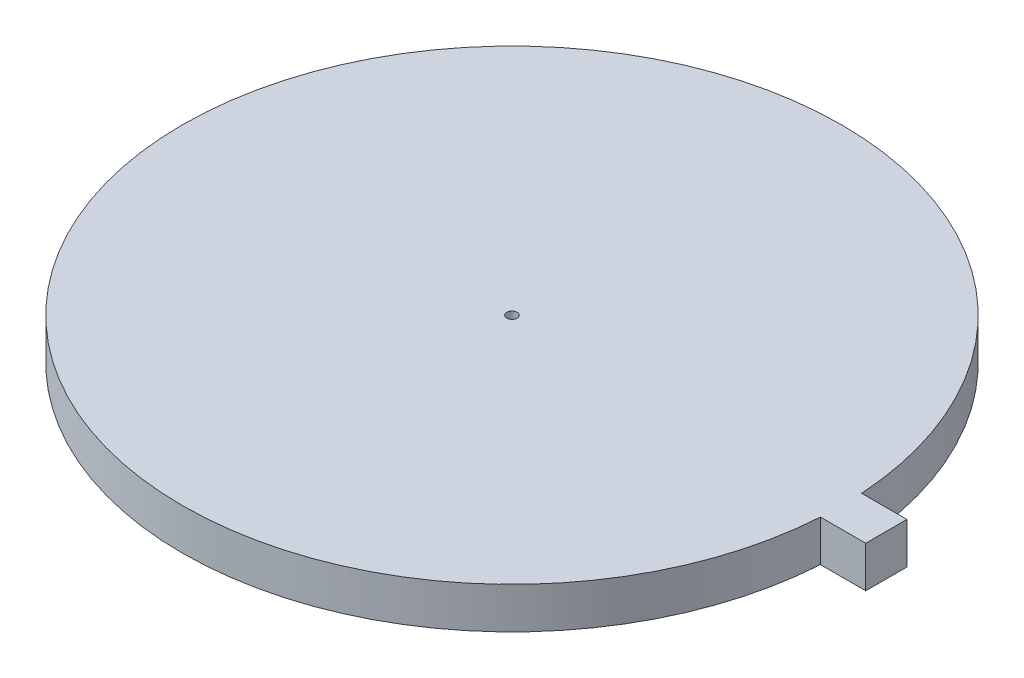
ISO-10303-21;
HEADER;
FILE_DESCRIPTION(('STEP AP214'),'2;1');
FILE_NAME('part.step','',(''),(''),'','','');
FILE_SCHEMA(('AUTOMOTIVE_DESIGN { 1 0 10303 214 1 1 1 1 }'));
ENDSEC;
DATA;
#1=APPLICATION_CONTEXT('core data for automotive mechanical design processes');
#2=APPLICATION_PROTOCOL_DEFINITION('international standard','automotive_design',2000,#1);
#3=PRODUCT_CONTEXT('',#1,'mechanical');
#4=PRODUCT('Part','Part','',(#3));
#5=PRODUCT_RELATED_PRODUCT_CATEGORY('part','',(#4));
#6=PRODUCT_DEFINITION_FORMATION('','',#4);
#7=PRODUCT_DEFINITION_CONTEXT('part definition',#1,'design');
#8=PRODUCT_DEFINITION('design','',#6,#7);
#9=PRODUCT_DEFINITION_SHAPE('','',#8);
#10=(LENGTH_UNIT() NAMED_UNIT(*) SI_UNIT(.MILLI.,.METRE.));
#11=(NAMED_UNIT(*) PLANE_ANGLE_UNIT() SI_UNIT($,.RADIAN.));
#12=(NAMED_UNIT(*) SI_UNIT($,.STERADIAN.) SOLID_ANGLE_UNIT());
#13=UNCERTAINTY_MEASURE_WITH_UNIT(LENGTH_MEASURE(1.E-05),#10,'distance_accuracy_value','');
#14=(GEOMETRIC_REPRESENTATION_CONTEXT(3) GLOBAL_UNCERTAINTY_ASSIGNED_CONTEXT((#13)) GLOBAL_UNIT_ASSIGNED_CONTEXT((#10,
#11,#12)) REPRESENTATION_CONTEXT('',''));
#15=CARTESIAN_POINT('',(0.,0.,0.));
#16=DIRECTION('',(0.,0.,1.));
#17=DIRECTION('',(1.,0.,0.));
#18=AXIS2_PLACEMENT_3D('',#15,#16,#17);
#19=CARTESIAN_POINT('',(0.,12.7,0.));
#20=DIRECTION('',(0.,1.,0.));
#21=DIRECTION('',(0.,0.,1.));
#22=AXIS2_PLACEMENT_3D('',#19,#20,#21);
#23=PLANE('',#22);
#24=DIRECTION('',(-1.,0.,0.));
#25=VECTOR('',#24,1.);
#26=CARTESIAN_POINT('',(115.371368333963,12.7,-6.35));
#27=LINE('',#26,#25);
#28=CARTESIAN_POINT('',(115.371368333963,12.7,-6.35));
#29=VERTEX_POINT('',#28);
#30=CARTESIAN_POINT('',(101.401368333963,12.7,-6.35));
#31=VERTEX_POINT('',#30);
#32=EDGE_CURVE('E114',#29,#31,#27,.T.);
#33=ORIENTED_EDGE('',*,*,#32,.T.);
#34=CARTESIAN_POINT('',(0.,12.7,0.));
#35=DIRECTION('',(0.,1.,0.));
#36=DIRECTION('',(0.,0.,1.));
#37=AXIS2_PLACEMENT_3D('',#34,#35,#36);
#38=CIRCLE('',#37,101.6);
#39=CARTESIAN_POINT('',(101.401368333963,12.7,6.34999999999997));
#40=VERTEX_POINT('',#39);
#41=EDGE_CURVE('E109',#31,#40,#38,.T.);
#42=ORIENTED_EDGE('',*,*,#41,.T.);
#43=DIRECTION('',(-1.,0.,0.));
#44=VECTOR('',#43,1.);
#45=CARTESIAN_POINT('',(115.371368333963,12.7,6.35));
#46=LINE('',#45,#44);
#47=CARTESIAN_POINT('',(115.371368333963,12.7,6.35));
#48=VERTEX_POINT('',#47);
#49=EDGE_CURVE('E112',#48,#40,#46,.T.);
#50=ORIENTED_EDGE('',*,*,#49,.F.);
#51=DIRECTION('',(0.,0.,1.));
#52=VECTOR('',#51,1.);
#53=CARTESIAN_POINT('',(115.371368333963,12.7,3.17500000000013));
#54=LINE('',#53,#52);
#55=EDGE_CURVE('E81',#29,#48,#54,.T.);
#56=ORIENTED_EDGE('',*,*,#55,.F.);
#57=EDGE_LOOP('',(#33,#42,#50,#56));
#58=FACE_BOUND('',#57,.T.);
#59=CARTESIAN_POINT('',(0.,12.7,0.));
#60=DIRECTION('',(0.,1.,0.));
#61=DIRECTION('',(0.,0.,1.));
#62=AXIS2_PLACEMENT_3D('',#59,#60,#61);
#63=CIRCLE('',#62,1.5875);
#64=CARTESIAN_POINT('',(0.,12.7,1.5875));
#65=VERTEX_POINT('',#64);
#66=EDGE_CURVE('E137',#65,#65,#63,.T.);
#67=ORIENTED_EDGE('',*,*,#66,.F.);
#68=EDGE_LOOP('',(#67));
#69=FACE_BOUND('',#68,.T.);
#70=ADVANCED_FACE('F63',(#58,#69),#23,.T.);
#71=CARTESIAN_POINT('',(0.,0.,0.));
#72=DIRECTION('',(0.,1.,0.));
#73=DIRECTION('',(0.,0.,1.));
#74=AXIS2_PLACEMENT_3D('',#71,#72,#73);
#75=PLANE('',#74);
#76=DIRECTION('',(-1.,0.,0.));
#77=VECTOR('',#76,1.);
#78=CARTESIAN_POINT('',(115.371368333963,0.,-6.35));
#79=LINE('',#78,#77);
#80=CARTESIAN_POINT('',(115.371368333963,0.,-6.35));
#81=VERTEX_POINT('',#80);
#82=CARTESIAN_POINT('',(101.401368333963,0.,-6.35));
#83=VERTEX_POINT('',#82);
#84=EDGE_CURVE('E133',#81,#83,#79,.T.);
#85=ORIENTED_EDGE('',*,*,#84,.F.);
#86=DIRECTION('',(0.,0.,-1.));
#87=VECTOR('',#86,1.);
#88=CARTESIAN_POINT('',(115.371368333963,0.,3.17500000000013));
#89=LINE('',#88,#87);
#90=CARTESIAN_POINT('',(115.371368333963,0.,6.35));
#91=VERTEX_POINT('',#90);
#92=EDGE_CURVE('E99',#91,#81,#89,.T.);
#93=ORIENTED_EDGE('',*,*,#92,.F.);
#94=DIRECTION('',(-1.,0.,0.));
#95=VECTOR('',#94,1.);
#96=CARTESIAN_POINT('',(115.371368333963,0.,6.35));
#97=LINE('',#96,#95);
#98=CARTESIAN_POINT('',(101.401368333963,0.,6.34999999999997));
#99=VERTEX_POINT('',#98);
#100=EDGE_CURVE('E140',#91,#99,#97,.T.);
#101=ORIENTED_EDGE('',*,*,#100,.T.);
#102=CARTESIAN_POINT('',(0.,0.,0.));
#103=DIRECTION('',(0.,1.,0.));
#104=DIRECTION('',(0.,0.,1.));
#105=AXIS2_PLACEMENT_3D('',#102,#103,#104);
#106=CIRCLE('',#105,101.6);
#107=EDGE_CURVE('E120',#83,#99,#106,.T.);
#108=ORIENTED_EDGE('',*,*,#107,.F.);
#109=EDGE_LOOP('',(#85,#93,#101,#108));
#110=FACE_BOUND('',#109,.T.);
#111=CARTESIAN_POINT('',(0.,0.,0.));
#112=DIRECTION('',(0.,1.,0.));
#113=DIRECTION('',(0.,0.,1.));
#114=AXIS2_PLACEMENT_3D('',#111,#112,#113);
#115=CIRCLE('',#114,1.5875);
#116=CARTESIAN_POINT('',(0.,0.,1.5875));
#117=VERTEX_POINT('',#116);
#118=EDGE_CURVE('E154',#117,#117,#115,.T.);
#119=ORIENTED_EDGE('',*,*,#118,.T.);
#120=EDGE_LOOP('',(#119));
#121=FACE_BOUND('',#120,.T.);
#122=ADVANCED_FACE('F149',(#110,#121),#75,.F.);
#123=CARTESIAN_POINT('',(115.371368333963,12.7,-6.35));
#124=DIRECTION('',(0.,0.,1.));
#125=DIRECTION('',(1.,0.,0.));
#126=AXIS2_PLACEMENT_3D('',#123,#124,#125);
#127=PLANE('',#126);
#128=ORIENTED_EDGE('',*,*,#84,.T.);
#129=DIRECTION('',(0.,-1.,0.));
#130=VECTOR('',#129,1.);
#131=CARTESIAN_POINT('',(101.401368333963,12.7,-6.35));
#132=LINE('',#131,#130);
#133=EDGE_CURVE('E12',#31,#83,#132,.T.);
#134=ORIENTED_EDGE('',*,*,#133,.F.);
#135=ORIENTED_EDGE('',*,*,#32,.F.);
#136=DIRECTION('',(0.,-1.,0.));
#137=VECTOR('',#136,1.);
#138=CARTESIAN_POINT('',(115.371368333963,12.7,-6.35));
#139=LINE('',#138,#137);
#140=EDGE_CURVE('E129',#29,#81,#139,.T.);
#141=ORIENTED_EDGE('',*,*,#140,.T.);
#142=EDGE_LOOP('',(#128,#134,#135,#141));
#143=FACE_BOUND('',#142,.T.);
#144=ADVANCED_FACE('F65',(#143),#127,.F.);
#145=CARTESIAN_POINT('',(0.,12.7,0.));
#146=DIRECTION('',(0.,-1.,0.));
#147=DIRECTION('',(0.,0.,-1.));
#148=AXIS2_PLACEMENT_3D('',#145,#146,#147);
#149=CYLINDRICAL_SURFACE('',#148,101.6);
#150=ORIENTED_EDGE('',*,*,#107,.T.);
#151=DIRECTION('',(0.,-1.,0.));
#152=VECTOR('',#151,1.);
#153=CARTESIAN_POINT('',(101.401368333963,12.7,6.34999999999997));
#154=LINE('',#153,#152);
#155=EDGE_CURVE('E73',#40,#99,#154,.T.);
#156=ORIENTED_EDGE('',*,*,#155,.F.);
#157=ORIENTED_EDGE('',*,*,#41,.F.);
#158=ORIENTED_EDGE('',*,*,#133,.T.);
#159=EDGE_LOOP('',(#150,#156,#157,#158));
#160=FACE_BOUND('',#159,.T.);
#161=ADVANCED_FACE('F119',(#160),#149,.T.);
#162=CARTESIAN_POINT('',(115.371368333963,12.7,6.35));
#163=DIRECTION('',(0.,0.,1.));
#164=DIRECTION('',(1.,0.,0.));
#165=AXIS2_PLACEMENT_3D('',#162,#163,#164);
#166=PLANE('',#165);
#167=ORIENTED_EDGE('',*,*,#100,.F.);
#168=DIRECTION('',(0.,-1.,0.));
#169=VECTOR('',#168,1.);
#170=CARTESIAN_POINT('',(115.371368333963,12.7,6.35));
#171=LINE('',#170,#169);
#172=EDGE_CURVE('E124',#48,#91,#171,.T.);
#173=ORIENTED_EDGE('',*,*,#172,.F.);
#174=ORIENTED_EDGE('',*,*,#49,.T.);
#175=ORIENTED_EDGE('',*,*,#155,.T.);
#176=EDGE_LOOP('',(#167,#173,#174,#175));
#177=FACE_BOUND('',#176,.T.);
#178=ADVANCED_FACE('F125',(#177),#166,.T.);
#179=CARTESIAN_POINT('',(115.371368333963,12.7,3.17500000000013));
#180=DIRECTION('',(-1.,0.,0.));
#181=DIRECTION('',(0.,0.,1.));
#182=AXIS2_PLACEMENT_3D('',#179,#180,#181);
#183=PLANE('',#182);
#184=ORIENTED_EDGE('',*,*,#92,.T.);
#185=ORIENTED_EDGE('',*,*,#140,.F.);
#186=ORIENTED_EDGE('',*,*,#55,.T.);
#187=ORIENTED_EDGE('',*,*,#172,.T.);
#188=EDGE_LOOP('',(#184,#185,#186,#187));
#189=FACE_BOUND('',#188,.T.);
#190=ADVANCED_FACE('F148',(#189),#183,.F.);
#191=CARTESIAN_POINT('',(0.,12.7,0.));
#192=DIRECTION('',(0.,-1.,0.));
#193=DIRECTION('',(0.,0.,-1.));
#194=AXIS2_PLACEMENT_3D('',#191,#192,#193);
#195=CYLINDRICAL_SURFACE('',#194,1.5875);
#196=ORIENTED_EDGE('',*,*,#66,.T.);
#197=EDGE_LOOP('',(#196));
#198=FACE_BOUND('',#197,.T.);
#199=ORIENTED_EDGE('',*,*,#118,.F.);
#200=EDGE_LOOP('',(#199));
#201=FACE_BOUND('',#200,.T.);
#202=ADVANCED_FACE('F162',(#198,#201),#195,.F.);
#203=CLOSED_SHELL('',(#70,#122,#144,#161,#178,#190,#202));
#204=MANIFOLD_SOLID_BREP('B2',#203);
#205=ADVANCED_BREP_SHAPE_REPRESENTATION('',(#18,#204),#14);
#206=SHAPE_DEFINITION_REPRESENTATION(#9,#205);
ENDSEC;
END-ISO-10303-21;
